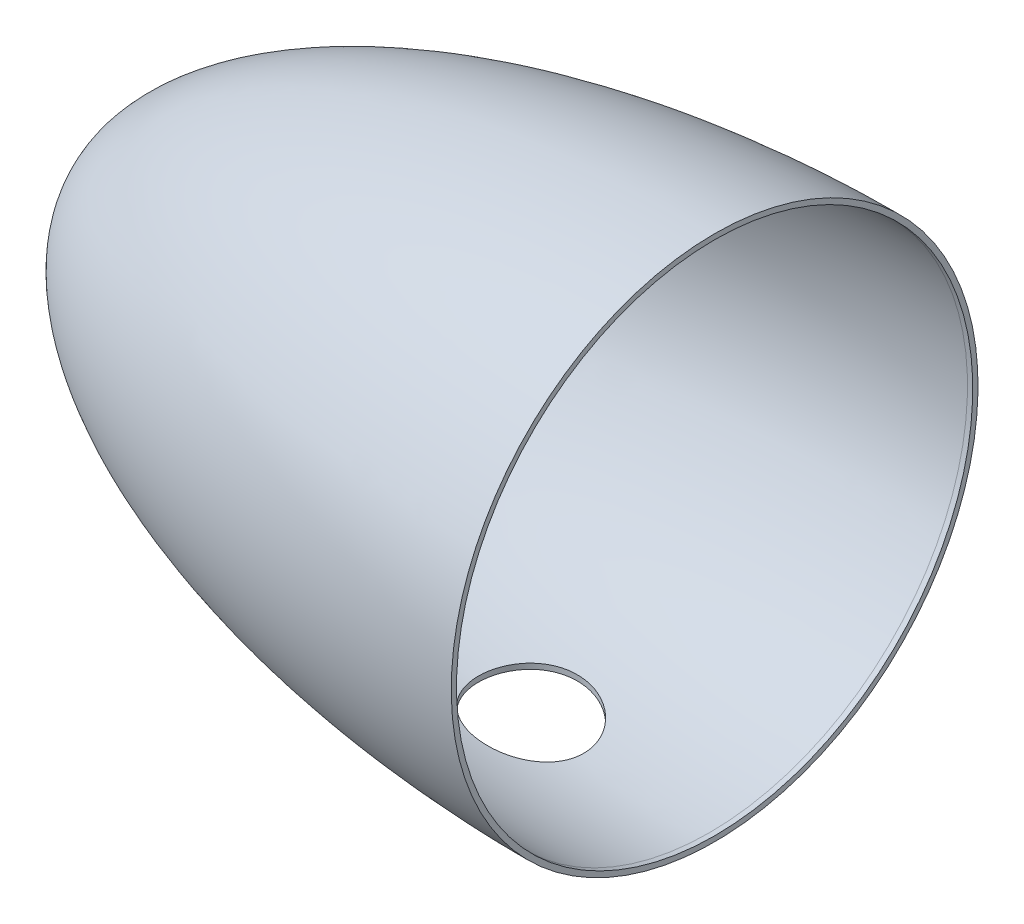
ISO-10303-21;
HEADER;
FILE_DESCRIPTION(('STEP AP214'),'2;1');
FILE_NAME('part.step','',(''),(''),'','','');
FILE_SCHEMA(('AUTOMOTIVE_DESIGN { 1 0 10303 214 1 1 1 1 }'));
ENDSEC;
DATA;
#1=APPLICATION_CONTEXT('core data for automotive mechanical design processes');
#2=APPLICATION_PROTOCOL_DEFINITION('international standard','automotive_design',2000,#1);
#3=PRODUCT_CONTEXT('',#1,'mechanical');
#4=PRODUCT('Part','Part','',(#3));
#5=PRODUCT_RELATED_PRODUCT_CATEGORY('part','',(#4));
#6=PRODUCT_DEFINITION_FORMATION('','',#4);
#7=PRODUCT_DEFINITION_CONTEXT('part definition',#1,'design');
#8=PRODUCT_DEFINITION('design','',#6,#7);
#9=PRODUCT_DEFINITION_SHAPE('','',#8);
#10=(LENGTH_UNIT() NAMED_UNIT(*) SI_UNIT(.MILLI.,.METRE.));
#11=(NAMED_UNIT(*) PLANE_ANGLE_UNIT() SI_UNIT($,.RADIAN.));
#12=(NAMED_UNIT(*) SI_UNIT($,.STERADIAN.) SOLID_ANGLE_UNIT());
#13=UNCERTAINTY_MEASURE_WITH_UNIT(LENGTH_MEASURE(1.E-05),#10,'distance_accuracy_value','');
#14=(GEOMETRIC_REPRESENTATION_CONTEXT(3) GLOBAL_UNCERTAINTY_ASSIGNED_CONTEXT((#13)) GLOBAL_UNIT_ASSIGNED_CONTEXT((#10,
#11,#12)) REPRESENTATION_CONTEXT('',''));
#15=CARTESIAN_POINT('',(0.,0.,0.));
#16=DIRECTION('',(0.,0.,1.));
#17=DIRECTION('',(1.,0.,0.));
#18=AXIS2_PLACEMENT_3D('',#15,#16,#17);
#19=CARTESIAN_POINT('',(0.,0.,0.));
#20=DIRECTION('',(0.,0.,1.));
#21=DIRECTION('',(-1.,0.,0.));
#22=AXIS2_PLACEMENT_3D('',#19,#20,#21);
#23=ELLIPSE('',#22,350.,150.);
#24=TRIMMED_CURVE('',#23,(PARAMETER_VALUE(3.14159265358979)),
(PARAMETER_VALUE(6.28318530717959)),.T.,.PARAMETER.);
#25=CARTESIAN_POINT('',(0.,0.,0.));
#26=DIRECTION('',(1.,0.,0.));
#27=AXIS1_PLACEMENT('',#25,#26);
#28=SURFACE_OF_REVOLUTION('',#24,#27);
#29=CARTESIAN_POINT('',(-104.509187939606,-139.978166426188,30.));
#30=CARTESIAN_POINT('',(-105.338743549904,-139.864409123884,29.9999958957549));
#31=CARTESIAN_POINT('',(-106.169189887263,-139.756422569953,29.9655657445175));
#32=CARTESIAN_POINT('',(-107.825939393802,-139.552798123035,29.827677399063));
#33=CARTESIAN_POINT('',(-108.652241938031,-139.457162041878,29.7242090905519));
#34=CARTESIAN_POINT('',(-110.295245014499,-139.278641355977,29.4485274819358));
#35=CARTESIAN_POINT('',(-111.111939323847,-139.195764635774,29.2762719096667));
#36=CARTESIAN_POINT('',(-112.729229614361,-139.042945984927,28.8639448591948));
#37=CARTESIAN_POINT('',(-113.52982619598,-138.973003571026,28.6238759155053));
#38=CARTESIAN_POINT('',(-115.109115356028,-138.845813944566,28.077388644288));
#39=CARTESIAN_POINT('',(-115.887807215015,-138.788567148559,27.7709681403711));
#40=CARTESIAN_POINT('',(-117.417538320646,-138.686216760411,27.0938029327586));
#41=CARTESIAN_POINT('',(-118.16857728161,-138.64111329369,26.7230575647552));
#42=CARTESIAN_POINT('',(-119.637393720246,-138.562209912002,25.9198371795799));
#43=CARTESIAN_POINT('',(-120.355174992817,-138.528408704631,25.4873692284101));
#44=CARTESIAN_POINT('',(-121.752323971302,-138.471010869237,24.5637040215406));
#45=CARTESIAN_POINT('',(-122.431691809935,-138.447414205956,24.0725069687713));
#46=CARTESIAN_POINT('',(-123.744708351226,-138.409206739241,23.0367409620322));
#47=CARTESIAN_POINT('',(-124.378513848343,-138.394563674321,22.4923719217593));
#48=CARTESIAN_POINT('',(-125.598588740537,-138.372717961579,21.352613040295));
#49=CARTESIAN_POINT('',(-126.184858251184,-138.365515295668,20.7572233231539));
#50=CARTESIAN_POINT('',(-127.305744914369,-138.357059915779,19.5195814184548));
#51=CARTESIAN_POINT('',(-127.840359928597,-138.355807448014,18.8773272928096));
#52=CARTESIAN_POINT('',(-128.854164618362,-138.357741929516,17.5504759378412));
#53=CARTESIAN_POINT('',(-129.333353978537,-138.360928904041,16.8658784676257));
#54=CARTESIAN_POINT('',(-130.235833477877,-138.370296144782,15.4546332414256));
#55=CARTESIAN_POINT('',(-130.65874773306,-138.376495366183,14.7277452094531));
#56=CARTESIAN_POINT('',(-131.442076692454,-138.390480639504,13.2410526969513));
#57=CARTESIAN_POINT('',(-131.802491167351,-138.398266697247,12.4812480956623));
#58=CARTESIAN_POINT('',(-132.458287511159,-138.414150372468,10.934065973558));
#59=CARTESIAN_POINT('',(-132.75366862663,-138.422247993555,10.1466881334166));
#60=CARTESIAN_POINT('',(-133.277311854264,-138.437661837431,8.549913604128));
#61=CARTESIAN_POINT('',(-133.505573885517,-138.444978059278,7.74051688843902));
#62=CARTESIAN_POINT('',(-133.894097239862,-138.457979560752,6.10232874860911));
#63=CARTESIAN_POINT('',(-134.054099391578,-138.463658598275,5.27347579336066));
#64=CARTESIAN_POINT('',(-134.30371284332,-138.472716182388,3.60522304090774));
#65=CARTESIAN_POINT('',(-134.393323944158,-138.47609472247,2.76582321386531));
#66=CARTESIAN_POINT('',(-134.501514446623,-138.480191534421,1.08245394620632));
#67=CARTESIAN_POINT('',(-134.520094061573,-138.48090981428,0.238484519320945));
#68=CARTESIAN_POINT('',(-134.486089184339,-138.479611021506,-1.44801638568287));
#69=CARTESIAN_POINT('',(-134.433504772559,-138.477593951964,-2.29054786542489));
#70=CARTESIAN_POINT('',(-134.257600640502,-138.471038531807,-3.96767474423882));
#71=CARTESIAN_POINT('',(-134.134323168818,-138.466501687148,-4.8022745809506));
#72=CARTESIAN_POINT('',(-133.817943947503,-138.455399047064,-6.45811900243092));
#73=CARTESIAN_POINT('',(-133.624842196804,-138.448833251608,-7.27936358699515));
#74=CARTESIAN_POINT('',(-133.170184671108,-138.434427027663,-8.90268203555648));
#75=CARTESIAN_POINT('',(-132.908627829112,-138.426586579307,-9.70475560052498));
#76=CARTESIAN_POINT('',(-132.318917753827,-138.410623699659,-11.2840328642185));
#77=CARTESIAN_POINT('',(-131.990764469945,-138.402501268153,-12.0612365440498));
#78=CARTESIAN_POINT('',(-131.27000036921,-138.387167957517,-13.5856587866955));
#79=CARTESIAN_POINT('',(-130.87735639443,-138.379957550698,-14.3328616773549));
#80=CARTESIAN_POINT('',(-130.030513918767,-138.367817208568,-15.7915531283387));
#81=CARTESIAN_POINT('',(-129.576315376028,-138.362887274808,-16.5030416643779));
#82=CARTESIAN_POINT('',(-128.609589685911,-138.3567895005,-17.8852423007414));
#83=CARTESIAN_POINT('',(-128.097062549759,-138.355621659228,-18.5559544089134));
#84=CARTESIAN_POINT('',(-127.017335408431,-138.358594540853,-19.8518149677959));
#85=CARTESIAN_POINT('',(-126.450135499982,-138.362735254358,-20.4769634991141));
#86=CARTESIAN_POINT('',(-125.265817936962,-138.377870558376,-21.6765283094474));
#87=CARTESIAN_POINT('',(-124.648758592391,-138.388857240758,-22.25100225244));
#88=CARTESIAN_POINT('',(-123.368611930407,-138.419173669656,-23.3459101078248));
#89=CARTESIAN_POINT('',(-122.705524643754,-138.438503410597,-23.8663440563304));
#90=CARTESIAN_POINT('',(-121.338194767985,-138.486887224056,-24.8494163342362));
#91=CARTESIAN_POINT('',(-120.633954481623,-138.515940752899,-25.3120578929253));
#92=CARTESIAN_POINT('',(-119.189466483789,-138.584981337508,-26.1762825079596));
#93=CARTESIAN_POINT('',(-118.449218984413,-138.624968328878,-26.5778659239039));
#94=CARTESIAN_POINT('',(-116.943210573622,-138.716550328558,-27.3147061387559));
#95=CARTESIAN_POINT('',(-116.177651358367,-138.768066616895,-27.6503850363899));
#96=CARTESIAN_POINT('',(-114.622025568928,-138.883543405941,-28.2564564470359));
#97=CARTESIAN_POINT('',(-113.831959125499,-138.947503840266,-28.5268493083052));
#98=CARTESIAN_POINT('',(-112.233129602056,-139.088248942741,-29.0006187488452));
#99=CARTESIAN_POINT('',(-111.424367128959,-139.165033195101,-29.2039975002931));
#100=CARTESIAN_POINT('',(-109.794003274363,-139.331478592643,-29.5425780051082));
#101=CARTESIAN_POINT('',(-108.972401873518,-139.421139757229,-29.6777796557416));
#102=CARTESIAN_POINT('',(-107.323418828471,-139.61291421105,-29.8792417452727));
#103=CARTESIAN_POINT('',(-106.496046851021,-139.715009948075,-29.9455981319098));
#104=CARTESIAN_POINT('',(-104.840216613033,-139.931126184732,-30.0096134609459));
#105=CARTESIAN_POINT('',(-104.011758355517,-140.045146651244,-30.0072725941372));
#106=CARTESIAN_POINT('',(-102.359401722701,-140.284174203556,-29.9343010297472));
#107=CARTESIAN_POINT('',(-101.535503656114,-140.40918202373,-29.8636657643253));
#108=CARTESIAN_POINT('',(-99.8978494635359,-140.668936764034,-29.6549651821095));
#109=CARTESIAN_POINT('',(-99.0840934828063,-140.803683823467,-29.5168989006651));
#110=CARTESIAN_POINT('',(-97.458761089981,-141.083702975206,-29.1717844412841));
#111=CARTESIAN_POINT('',(-96.6474417045982,-141.229111944834,-28.9636367190021));
#112=CARTESIAN_POINT('',(-95.0461509779131,-141.526618658008,-28.480700575356));
#113=CARTESIAN_POINT('',(-94.2561798420563,-141.678716465887,-28.2059115129204));
#114=CARTESIAN_POINT('',(-92.7026015679328,-141.987600374554,-27.5917075390245));
#115=CARTESIAN_POINT('',(-91.9389979605136,-142.144387098023,-27.2522840117733));
#116=CARTESIAN_POINT('',(-90.4431515397807,-142.46044825905,-26.5111928502364));
#117=CARTESIAN_POINT('',(-89.710909173832,-142.619722732049,-26.109524328409));
#118=CARTESIAN_POINT('',(-88.2658826431785,-142.942156650841,-25.236560553599));
#119=CARTESIAN_POINT('',(-87.5539443714365,-143.105320477764,-24.7638658295831));
#120=CARTESIAN_POINT('',(-86.172611449079,-143.429282974956,-23.7591950481605));
#121=CARTESIAN_POINT('',(-85.5032175431278,-143.59008160379,-23.2272179535686));
#122=CARTESIAN_POINT('',(-84.2115597987651,-143.906712316464,-22.1073951143535));
#123=CARTESIAN_POINT('',(-83.5892989299539,-144.062544087013,-21.5195458547771));
#124=CARTESIAN_POINT('',(-82.3963979874525,-144.366610983604,-20.2917987943763));
#125=CARTESIAN_POINT('',(-81.8257575767861,-144.514846159233,-19.6519013333723));
#126=CARTESIAN_POINT('',(-80.7397986666113,-144.801283368693,-18.3235584870131));
#127=CARTESIAN_POINT('',(-80.2245357363267,-144.939475280295,-17.6350654643411));
#128=CARTESIAN_POINT('',(-79.2540161677028,-145.203165120506,-16.2146884565905));
#129=CARTESIAN_POINT('',(-78.7987598775563,-145.328662975456,-15.4828042197669));
#130=CARTESIAN_POINT('',(-77.9520837400245,-145.564592175889,-13.9808186277803));
#131=CARTESIAN_POINT('',(-77.5606538522039,-145.675025890641,-13.2107233084528));
#132=CARTESIAN_POINT('',(-76.8449601385876,-145.878703942698,-11.6377422160594));
#133=CARTESIAN_POINT('',(-76.5206941924154,-145.971948822647,-10.834857479119));
#134=CARTESIAN_POINT('',(-75.9512239930217,-146.136795838866,-9.2275161616858));
#135=CARTESIAN_POINT('',(-75.7038867387012,-146.208977599074,-8.42387441286576));
#136=CARTESIAN_POINT('',(-75.2772816156569,-146.334050341257,-6.79724718572349));
#137=CARTESIAN_POINT('',(-75.0980124500897,-146.386941690754,-5.97426207625113));
#138=CARTESIAN_POINT('',(-74.8092333401842,-146.472379494725,-4.31526170442513));
#139=CARTESIAN_POINT('',(-74.6997097382396,-146.504929932342,-3.47924902600423));
#140=CARTESIAN_POINT('',(-74.5514089760834,-146.549047769089,-1.80042624696612));
#141=CARTESIAN_POINT('',(-74.5126302485059,-146.56061563309,-0.957616297359253));
#142=CARTESIAN_POINT('',(-74.5062934090335,-146.562504784111,0.699646848759912));
#143=CARTESIAN_POINT('',(-74.5363617974382,-146.553534135716,1.51409122430884));
#144=CARTESIAN_POINT('',(-74.6625864626391,-146.515967151646,3.13736868851193));
#145=CARTESIAN_POINT('',(-74.7587410155191,-146.487371327911,3.94620192298176));
#146=CARTESIAN_POINT('',(-75.0162775558513,-146.411092244035,5.55246192487814));
#147=CARTESIAN_POINT('',(-75.1776571645565,-146.363409679985,6.34988910718355));
#148=CARTESIAN_POINT('',(-75.5642409556115,-146.249839510907,7.92779067630414));
#149=CARTESIAN_POINT('',(-75.7894456786084,-146.183951751667,8.70826491945479));
#150=CARTESIAN_POINT('',(-76.3012075259254,-146.035333175598,10.2452148204748));
#151=CARTESIAN_POINT('',(-76.5876266808621,-145.952640255676,11.0017401250269));
#152=CARTESIAN_POINT('',(-77.2197987273033,-145.771778434569,12.4876393491821));
#153=CARTESIAN_POINT('',(-77.5655512684532,-145.673609624767,13.2170134290781));
#154=CARTESIAN_POINT('',(-78.3137543156959,-145.463466499498,14.6440563311143));
#155=CARTESIAN_POINT('',(-78.7162093072636,-145.351491091941,15.3417226392156));
#156=CARTESIAN_POINT('',(-79.5748438307175,-145.115595273529,16.7010414036838));
#157=CARTESIAN_POINT('',(-80.0310246153793,-144.991674584146,17.3626930197355));
#158=CARTESIAN_POINT('',(-81.0087598076109,-144.729901799592,18.6658424908613));
#159=CARTESIAN_POINT('',(-81.5318948460109,-144.591738194436,19.3060921458477));
#160=CARTESIAN_POINT('',(-82.6281644947341,-144.307101307976,20.540255708584));
#161=CARTESIAN_POINT('',(-83.2013001176967,-144.160627858397,21.1341686774362));
#162=CARTESIAN_POINT('',(-84.3938955092799,-143.861649017912,22.2722840441067));
#163=CARTESIAN_POINT('',(-85.0133711982901,-143.709141562545,22.8164692136923));
#164=CARTESIAN_POINT('',(-86.2944257895102,-143.400488657051,23.8516380939217));
#165=CARTESIAN_POINT('',(-86.9560050040686,-143.244343179939,24.3426214098102));
#166=CARTESIAN_POINT('',(-88.3404865186817,-142.925342072711,25.2843401527412));
#167=CARTESIAN_POINT('',(-89.0647151163842,-142.762440305564,25.7331115868763));
#168=CARTESIAN_POINT('',(-90.5489414719971,-142.437727411106,26.5675813667553));
#169=CARTESIAN_POINT('',(-91.3089417290532,-142.275916360904,26.9532752972141));
#170=CARTESIAN_POINT('',(-92.8590175856059,-141.955919230222,27.6585988411366));
#171=CARTESIAN_POINT('',(-93.6490702549936,-141.797730527876,27.9782776728083));
#172=CARTESIAN_POINT('',(-95.2544284975173,-141.487119958405,28.5495183064));
#173=CARTESIAN_POINT('',(-96.0697292857015,-141.334697010588,28.8010929282581));
#174=CARTESIAN_POINT('',(-97.513670434811,-141.074806943935,29.1799975840899));
#175=CARTESIAN_POINT('',(-98.1380263588133,-140.965626346661,29.3226653980987));
#176=CARTESIAN_POINT('',(-99.3955817954601,-140.752403092488,29.5679120340228));
#177=CARTESIAN_POINT('',(-100.028782843639,-140.648361342289,29.6704838032897));
#178=CARTESIAN_POINT('',(-101.301365982725,-140.446142102891,29.8349038921474));
#179=CARTESIAN_POINT('',(-101.940747921423,-140.347964469707,29.8967532119862));
#180=CARTESIAN_POINT('',(-103.222971083327,-140.158090477504,29.9792989321614));
#181=CARTESIAN_POINT('',(-103.865811623145,-140.066392885292,30.0000031831189));
#182=CARTESIAN_POINT('',(-104.509187939606,-139.978166426188,30.));
#183=B_SPLINE_CURVE_WITH_KNOTS('',3,(#29,#30,#31,#32,#33,#34,#35,#36,#37,#38,#39,#40,#41,#42,
#43,#44,#45,#46,#47,#48,#49,#50,#51,#52,#53,#54,#55,#56,#57,#58,#59,#60,#61,#62,#63,#64,#65,#66,
#67,#68,#69,#70,#71,#72,#73,#74,#75,#76,#77,#78,#79,#80,#81,#82,#83,#84,#85,#86,#87,#88,#89,#90,
#91,#92,#93,#94,#95,#96,#97,#98,#99,#100,#101,#102,#103,#104,#105,#106,#107,#108,#109,#110,#111,
#112,#113,#114,#115,#116,#117,#118,#119,#120,#121,#122,#123,#124,#125,#126,#127,#128,#129,#130,
#131,#132,#133,#134,#135,#136,#137,#138,#139,#140,#141,#142,#143,#144,#145,#146,#147,#148,#149,
#150,#151,#152,#153,#154,#155,#156,#157,#158,#159,#160,#161,#162,#163,#164,#165,#166,#167,#168,
#169,#170,#171,#172,#173,#174,#175,#176,#177,#178,#179,#180,#181,#182),.UNSPECIFIED.,.T.,.F.,(4,
2,2,2,2,2,2,2,2,2,2,2,2,2,2,2,2,2,2,2,2,2,2,2,2,2,2,2,2,2,2,2,2,2,2,2,2,2,2,2,2,2,2,2,2,2,2,2,2,
2,2,2,2,2,2,2,2,2,2,2,2,2,2,2,2,2,2,2,2,2,2,2,2,2,2,2,4),(0.,2.51139131608301,5.02315063922567,
7.53645590703146,10.0496672529024,12.56296104679,15.076280797978,17.589313054734,
20.1023366282996,22.6062511129578,25.1101595098477,27.6141715151347,30.118197767114,
32.6381892819802,35.158190042635,37.6782199971255,40.19825298943,42.7277707629111,
45.2572956942169,47.7868130287747,50.3163275053767,52.8443318306275,55.3723361945535,
57.900379964468,60.4284256549072,62.957775233867,65.4871265327189,68.0164773447767,
70.5458236819862,73.0722536434333,75.5986819165314,78.1249689561615,80.6512411167611,
83.1607638602974,85.6702732169196,88.1797012229817,90.6891330104022,93.1950627549921,
95.7009855398826,98.2070759439026,100.713202200449,103.260637981444,105.808098269044,
108.355898371775,110.903734806534,113.510697283792,116.117705378782,118.724877590996,
121.332032782463,123.94178019879,126.551542757699,129.160894381902,131.770163615893,
134.298823796969,136.827435799212,139.355552495173,141.883613179562,144.325836758378,
146.767996632047,149.210067448581,151.652158951924,154.088803275024,156.525433210612,
158.96225600534,161.399135633047,163.911062953998,166.423041159699,168.935886368521,
171.448750221271,174.048004155758,176.647439954445,179.244930664787,181.841932082882,
183.789762544102,185.737935462762,187.686060527508,189.633813847573),.UNSPECIFIED.);
#184=CARTESIAN_POINT('',(-104.509187939606,-139.978166426188,30.));
#185=VERTEX_POINT('',#184);
#186=EDGE_CURVE('E69',#185,#185,#183,.T.);
#187=ORIENTED_EDGE('',*,*,#186,.F.);
#188=EDGE_LOOP('',(#187));
#189=FACE_BOUND('',#188,.T.);
#190=CARTESIAN_POINT('',(-350.,0.,0.));
#191=VERTEX_POINT('',#190);
#192=VERTEX_LOOP('',#191);
#193=FACE_BOUND('',#192,.T.);
#194=CARTESIAN_POINT('',(0.,0.,0.));
#195=DIRECTION('',(1.,0.,0.));
#196=DIRECTION('',(0.,1.,0.));
#197=AXIS2_PLACEMENT_3D('',#194,#195,#196);
#198=CIRCLE('',#197,150.);
#199=CARTESIAN_POINT('',(0.,150.,0.));
#200=VERTEX_POINT('',#199);
#201=EDGE_CURVE('E11',#200,#200,#198,.T.);
#202=ORIENTED_EDGE('',*,*,#201,.F.);
#203=EDGE_LOOP('',(#202));
#204=FACE_BOUND('',#203,.T.);
#205=ADVANCED_FACE('F33',(#189,#193,#204),#28,.F.);
#206=CARTESIAN_POINT('',(0.,150.,0.));
#207=DIRECTION('',(1.,0.,0.));
#208=DIRECTION('',(0.,1.,0.));
#209=AXIS2_PLACEMENT_3D('',#206,#207,#208);
#210=PLANE('',#209);
#211=ORIENTED_EDGE('',*,*,#201,.T.);
#212=EDGE_LOOP('',(#211));
#213=FACE_BOUND('',#212,.T.);
#214=CARTESIAN_POINT('',(0.,0.,0.));
#215=DIRECTION('',(1.,0.,0.));
#216=DIRECTION('',(0.,1.,0.));
#217=AXIS2_PLACEMENT_3D('',#214,#215,#216);
#218=CIRCLE('',#217,146.994469377078);
#219=CARTESIAN_POINT('',(0.,146.994469377078,0.));
#220=VERTEX_POINT('',#219);
#221=EDGE_CURVE('E46',#220,#220,#218,.T.);
#222=ORIENTED_EDGE('',*,*,#221,.F.);
#223=EDGE_LOOP('',(#222));
#224=FACE_BOUND('',#223,.T.);
#225=ADVANCED_FACE('F51',(#213,#224),#210,.T.);
#226=CARTESIAN_POINT('',(0.,0.,0.));
#227=DIRECTION('',(1.,0.,0.));
#228=DIRECTION('',(0.,1.,0.));
#229=AXIS2_PLACEMENT_3D('',#226,#227,#228);
#230=CYLINDRICAL_SURFACE('',#229,146.994469377078);
#231=ORIENTED_EDGE('',*,*,#221,.T.);
#232=EDGE_LOOP('',(#231));
#233=FACE_BOUND('',#232,.T.);
#234=CARTESIAN_POINT('',(-3.00000000000007,0.,0.));
#235=DIRECTION('',(1.,0.,0.));
#236=DIRECTION('',(0.,1.,0.));
#237=AXIS2_PLACEMENT_3D('',#234,#235,#236);
#238=CIRCLE('',#237,146.994469377078);
#239=CARTESIAN_POINT('',(-3.00000000000008,146.994469377078,0.));
#240=VERTEX_POINT('',#239);
#241=EDGE_CURVE('E61',#240,#240,#238,.T.);
#242=ORIENTED_EDGE('',*,*,#241,.F.);
#243=EDGE_LOOP('',(#242));
#244=FACE_BOUND('',#243,.T.);
#245=ADVANCED_FACE('F57',(#233,#244),#230,.F.);
#246=CARTESIAN_POINT('',(-346.926567102263,3.00000000000001,0.));
#247=CARTESIAN_POINT('',(-346.813727301466,5.3047588171815,0.));
#248=CARTESIAN_POINT('',(-346.331578228713,9.88186879817648,0.));
#249=CARTESIAN_POINT('',(-344.331694511466,19.0575246996472,0.));
#250=CARTESIAN_POINT('',(-339.887273398816,30.4741647483363,0.));
#251=CARTESIAN_POINT('',(-331.43238610795,44.008781696331,0.));
#252=CARTESIAN_POINT('',(-316.046042327794,61.6390253153621,0.));
#253=CARTESIAN_POINT('',(-289.294666984066,82.5186941538434,0.));
#254=CARTESIAN_POINT('',(-246.320556553486,104.604502967275,0.));
#255=CARTESIAN_POINT('',(-194.113298986661,122.809254684914,0.));
#256=CARTESIAN_POINT('',(-144.553080527012,134.145306343508,0.));
#257=CARTESIAN_POINT('',(-102.392138924449,140.653620405848,0.));
#258=CARTESIAN_POINT('',(-69.8098956548104,144.210411461595,0.));
#259=CARTESIAN_POINT('',(-36.5883233560263,146.408003651111,0.));
#260=CARTESIAN_POINT('',(-14.1774121707521,146.953256577554,0.));
#261=CARTESIAN_POINT('',(-3.00000000000017,146.994469377078,0.));
#262=B_SPLINE_CURVE_WITH_KNOTS('',3,(#246,#247,#248,#249,#250,#251,#252,#253,#254,#255,#256,
#257,#258,#259,#260,#261),.UNSPECIFIED.,.F.,.F.,(4,1,1,1,1,1,1,1,1,1,1,1,1,4),
(-1.56219318816714,-1.51403026219817,-1.46586733622921,-1.36954148429128,-1.27321563235336,
-1.17688978041543,-0.984238076539572,-0.791586372663717,-0.598934668787862,-0.406282964912006,
-0.309957112974078,-0.213631261036151,-0.117305409098223,-0.0209795571602953),.UNSPECIFIED.);
#263=CARTESIAN_POINT('',(0.,0.,0.));
#264=DIRECTION('',(1.,0.,0.));
#265=AXIS1_PLACEMENT('',#263,#264);
#266=SURFACE_OF_REVOLUTION('',#262,#265);
#267=CARTESIAN_POINT('',(-104.509187939606,-136.880951210008,30.));
#268=CARTESIAN_POINT('',(-103.654911344241,-136.998706609246,29.9999944223758));
#269=CARTESIAN_POINT('',(-102.801355414403,-137.122778307448,29.9634791165229));
#270=CARTESIAN_POINT('',(-101.102052795768,-137.382322629866,29.8180991991232));
#271=CARTESIAN_POINT('',(-100.256308127927,-137.517798117616,29.7092163682139));
#272=CARTESIAN_POINT('',(-98.5778015946764,-137.798740369295,29.4201394844112));
#273=CARTESIAN_POINT('',(-97.7450548075014,-137.944217811827,29.2398682049538));
#274=CARTESIAN_POINT('',(-96.0992986925087,-138.243184591943,28.8096713697247));
#275=CARTESIAN_POINT('',(-95.2862881725077,-138.396673443818,28.5597500326534));
#276=CARTESIAN_POINT('',(-93.6864521448917,-138.709394574895,27.9926371505616));
#277=CARTESIAN_POINT('',(-92.8995941128163,-138.868619164486,27.6755330784036));
#278=CARTESIAN_POINT('',(-91.3561477748239,-139.190742162197,26.9762002683071));
#279=CARTESIAN_POINT('',(-90.599559869219,-139.353640618858,26.5939706694566));
#280=CARTESIAN_POINT('',(-89.1217485958423,-139.680674949693,25.7671011391922));
#281=CARTESIAN_POINT('',(-88.4005193230799,-139.844810611931,25.3224716769664));
#282=CARTESIAN_POINT('',(-86.9980371045119,-140.171834231004,24.3736825006009));
#283=CARTESIAN_POINT('',(-86.3167843919418,-140.334722180554,23.8695224391935));
#284=CARTESIAN_POINT('',(-84.9899578895456,-140.658836378216,22.7977339653193));
#285=CARTESIAN_POINT('',(-84.3449864131303,-140.820010900054,22.229343854672));
#286=CARTESIAN_POINT('',(-83.1053521067862,-141.135720942753,21.0384070701929));
#287=CARTESIAN_POINT('',(-82.5106899029776,-141.290256380977,20.4158597225465));
#288=CARTESIAN_POINT('',(-81.3760563014676,-141.589997465041,19.1206550821162));
#289=CARTESIAN_POINT('',(-80.8360856642844,-141.735202981132,18.4479970927401));
#290=CARTESIAN_POINT('',(-79.8150315072965,-142.013657721031,17.0570488178125));
#291=CARTESIAN_POINT('',(-79.3339469392038,-142.14690715767,16.3387593449372));
#292=CARTESIAN_POINT('',(-78.4404518435345,-142.397311861864,14.8710938839514));
#293=CARTESIAN_POINT('',(-78.0272277197938,-142.514654314945,14.122245306403));
#294=CARTESIAN_POINT('',(-77.2654283846974,-142.733045341426,12.5900558802884));
#295=CARTESIAN_POINT('',(-76.9168528957725,-142.834093984783,11.8067151798323));
#296=CARTESIAN_POINT('',(-76.2875072534458,-143.017900637724,10.2113603066928));
#297=CARTESIAN_POINT('',(-76.0067223982133,-143.100662612827,9.3993523949639));
#298=CARTESIAN_POINT('',(-75.5154738427668,-143.246253747293,7.75259580379924));
#299=CARTESIAN_POINT('',(-75.3050077469176,-143.309083585706,6.91784790012267));
#300=CARTESIAN_POINT('',(-74.9630776741545,-143.411521232334,5.26428850290065));
#301=CARTESIAN_POINT('',(-74.8289037014481,-143.451924214437,4.4460857548569));
#302=CARTESIAN_POINT('',(-74.6287055758205,-143.512309666485,2.80064328599088));
#303=CARTESIAN_POINT('',(-74.5626796296114,-143.532292673773,1.97340380354555));
#304=CARTESIAN_POINT('',(-74.4993972123652,-143.551444036322,0.316182571293901));
#305=CARTESIAN_POINT('',(-74.5021305603613,-143.550615473085,-0.513798754340145));
#306=CARTESIAN_POINT('',(-74.5763162917766,-143.52816746718,-2.17039725744552));
#307=CARTESIAN_POINT('',(-74.6477679812083,-143.506548234477,-2.99701446880643));
#308=CARTESIAN_POINT('',(-74.8560987601611,-143.443735727711,-4.62030934592685));
#309=CARTESIAN_POINT('',(-74.9913107663488,-143.403041347664,-5.41722102341478));
#310=CARTESIAN_POINT('',(-75.3252609231974,-143.303041530213,-6.99640797372076));
#311=CARTESIAN_POINT('',(-75.5239977400218,-143.243736483579,-7.77868355348931));
#312=CARTESIAN_POINT('',(-75.9833185459128,-143.107590139199,-9.32330535014794));
#313=CARTESIAN_POINT('',(-76.2439043123285,-143.030748337502,-10.0856509936137));
#314=CARTESIAN_POINT('',(-76.8247921525943,-142.860891907087,-11.5853751343599));
#315=CARTESIAN_POINT('',(-77.1450952953459,-142.767876988882,-12.3227531844577));
#316=CARTESIAN_POINT('',(-77.8476342320224,-142.565921384058,-13.7776233283165));
#317=CARTESIAN_POINT('',(-78.2306490978547,-142.456782310077,-14.4947115608924));
#318=CARTESIAN_POINT('',(-79.0525158900199,-142.225413354051,-15.8939039723811));
#319=CARTESIAN_POINT('',(-79.4913680784571,-142.103183410558,-16.5760079870545));
#320=CARTESIAN_POINT('',(-80.421791168306,-141.847643084427,-17.9011975188458));
#321=CARTESIAN_POINT('',(-80.913369859053,-141.714331065281,-18.5442772488371));
#322=CARTESIAN_POINT('',(-81.9458023751351,-141.438780217973,-19.7875361554275));
#323=CARTESIAN_POINT('',(-82.4866574186833,-141.296541169144,-20.3877142707554));
#324=CARTESIAN_POINT('',(-83.6353639453503,-140.999845599784,-21.5634918290994));
#325=CARTESIAN_POINT('',(-84.2449732323997,-140.845130600894,-22.1373096294879));
#326=CARTESIAN_POINT('',(-85.5092760555797,-140.530960630364,-23.2314942232651));
#327=CARTESIAN_POINT('',(-86.1639706513181,-140.371505547372,-23.7518597596869));
#328=CARTESIAN_POINT('',(-87.5142301214935,-140.050322793373,-24.7359946314957));
#329=CARTESIAN_POINT('',(-88.2098011314418,-139.888594783989,-25.1997554382565));
#330=CARTESIAN_POINT('',(-89.6372394947742,-139.565334224118,-26.0676597349874));
#331=CARTESIAN_POINT('',(-90.3691072418763,-139.403801675772,-26.4718025780807));
#332=CARTESIAN_POINT('',(-91.8840155296579,-139.079103130853,-27.2275614809589));
#333=CARTESIAN_POINT('',(-92.6678933918714,-138.916004679195,-27.5775297665124));
#334=CARTESIAN_POINT('',(-94.2636781009153,-138.594913492954,-28.2093241687678));
#335=CARTESIAN_POINT('',(-95.0755855167321,-138.436920862145,-28.4911489012573));
#336=CARTESIAN_POINT('',(-96.7218621841532,-138.128280628437,-28.9844079266515));
#337=CARTESIAN_POINT('',(-97.5562309466265,-137.977632865794,-29.1958437510467));
#338=CARTESIAN_POINT('',(-99.2416219941969,-137.685685426899,-29.54646484432));
#339=CARTESIAN_POINT('',(-100.09264403741,-137.544385615002,-29.6856511617931));
#340=CARTESIAN_POINT('',(-101.79891853317,-137.273863878644,-29.8895833988627));
#341=CARTESIAN_POINT('',(-102.654093012672,-137.1445602762,-29.9548728396263));
#342=CARTESIAN_POINT('',(-104.368668373519,-136.898233725163,-30.011930666943));
#343=CARTESIAN_POINT('',(-105.22806924873,-136.781210758749,-30.0036991601836));
#344=CARTESIAN_POINT('',(-106.944589438295,-136.560478973197,-29.9133309730121));
#345=CARTESIAN_POINT('',(-107.801709033616,-136.45676843238,-29.8312038604562));
#346=CARTESIAN_POINT('',(-109.50724567943,-136.263277660775,-29.5932549305325));
#347=CARTESIAN_POINT('',(-110.355662908455,-136.173497143672,-29.4374346281076));
#348=CARTESIAN_POINT('',(-112.016150628811,-136.010166714858,-29.0577460938794));
#349=CARTESIAN_POINT('',(-112.828599228977,-135.936266577299,-28.8356801542366));
#350=CARTESIAN_POINT('',(-114.432931027445,-135.80176550505,-28.3236350828303));
#351=CARTESIAN_POINT('',(-115.224814566276,-135.741164350023,-28.0336570763955));
#352=CARTESIAN_POINT('',(-116.782053365105,-135.632757832072,-27.3877217693918));
#353=CARTESIAN_POINT('',(-117.547410041385,-135.584951785092,-27.031767997761));
#354=CARTESIAN_POINT('',(-119.045917902015,-135.501305982416,-26.2563359153815));
#355=CARTESIAN_POINT('',(-119.779069191258,-135.465466187743,-25.8368578115517));
#356=CARTESIAN_POINT('',(-121.198806955786,-135.405030514084,-24.9429654699581));
#357=CARTESIAN_POINT('',(-121.88585959826,-135.380300175981,-24.4693003816911));
#358=CARTESIAN_POINT('',(-123.218288118196,-135.340161574021,-23.4662508398246));
#359=CARTESIAN_POINT('',(-123.863664417579,-135.324753215776,-22.9368669504529));
#360=CARTESIAN_POINT('',(-125.108156982522,-135.301829469421,-21.8260886156175));
#361=CARTESIAN_POINT('',(-125.707272290054,-135.294314244729,-21.2446930935729));
#362=CARTESIAN_POINT('',(-126.855001799986,-135.285652769489,-20.0339809234686));
#363=CARTESIAN_POINT('',(-127.40361564835,-135.284506563586,-19.4046639395153));
#364=CARTESIAN_POINT('',(-128.44899479031,-135.287029102556,-18.0993956961801));
#365=CARTESIAN_POINT('',(-128.945499237516,-135.290720929259,-17.423235565738));
#366=CARTESIAN_POINT('',(-129.880149029627,-135.301399869622,-16.0317433951673));
#367=CARTESIAN_POINT('',(-130.318294259587,-135.308386989772,-15.3164112778889));
#368=CARTESIAN_POINT('',(-131.133165326189,-135.324175792152,-13.8515803057061));
#369=CARTESIAN_POINT('',(-131.509889893556,-135.332977511872,-13.1020807451318));
#370=CARTESIAN_POINT('',(-132.199272923401,-135.351044717211,-11.5741795900613));
#371=CARTESIAN_POINT('',(-132.511931180152,-135.360310204318,-10.7957779027651));
#372=CARTESIAN_POINT('',(-133.072629156646,-135.378181998303,-9.21089098335414));
#373=CARTESIAN_POINT('',(-133.320279508005,-135.38678412458,-8.4042679207783));
#374=CARTESIAN_POINT('',(-133.746783442717,-135.402291714165,-6.7730154090538));
#375=CARTESIAN_POINT('',(-133.925636749914,-135.409197170662,-5.94838588764015));
#376=CARTESIAN_POINT('',(-134.213271145088,-135.420586761419,-4.28697898959071));
#377=CARTESIAN_POINT('',(-134.322052327508,-135.425070898943,-3.45020162932964));
#378=CARTESIAN_POINT('',(-134.468765404823,-135.431169173998,-1.77044918407866));
#379=CARTESIAN_POINT('',(-134.506697394903,-135.432783315386,-0.927474107416912));
#380=CARTESIAN_POINT('',(-134.511440948888,-135.432983741814,0.758642252030858));
#381=CARTESIAN_POINT('',(-134.478255401137,-135.431570149821,1.60178352667636));
#382=CARTESIAN_POINT('',(-134.341007134039,-135.425853502363,3.28226757467323));
#383=CARTESIAN_POINT('',(-134.236944383209,-135.421550445614,4.11961034544868));
#384=CARTESIAN_POINT('',(-133.958683716383,-135.410484362511,5.78255202676912));
#385=CARTESIAN_POINT('',(-133.784485070241,-135.403721310547,6.60815081496109));
#386=CARTESIAN_POINT('',(-133.367194088114,-135.388442030748,8.2417330180957));
#387=CARTESIAN_POINT('',(-133.124101730217,-135.379925802355,9.04971642743521));
#388=CARTESIAN_POINT('',(-132.570764698989,-135.362101349049,10.6422976630071));
#389=CARTESIAN_POINT('',(-132.260523367968,-135.35279316357,11.4268966509779));
#390=CARTESIAN_POINT('',(-131.575080110626,-135.334567060501,12.9671919427299));
#391=CARTESIAN_POINT('',(-131.199878154789,-135.325649143087,13.7228882333782));
#392=CARTESIAN_POINT('',(-130.387175554709,-135.309568806473,15.2000111920917));
#393=CARTESIAN_POINT('',(-129.949675795442,-135.302406362338,15.9214383467749));
#394=CARTESIAN_POINT('',(-129.015473416607,-135.29133787686,17.3249123347412));
#395=CARTESIAN_POINT('',(-128.518770851869,-135.2874318325,18.006959204495));
#396=CARTESIAN_POINT('',(-127.469559473202,-135.284460350255,19.326984859827));
#397=CARTESIAN_POINT('',(-126.917036497785,-135.28539614377,19.9649523931212));
#398=CARTESIAN_POINT('',(-125.760240213294,-135.293723087801,21.1920686136674));
#399=CARTESIAN_POINT('',(-125.155966714004,-135.301114262046,21.7812171214612));
#400=CARTESIAN_POINT('',(-123.899933245979,-135.323930434944,22.9065515126699));
#401=CARTESIAN_POINT('',(-123.248165938279,-135.339356677488,23.4427291804976));
#402=CARTESIAN_POINT('',(-121.901986794792,-135.37972241964,24.4581549593986));
#403=CARTESIAN_POINT('',(-121.207575747421,-135.40466174341,24.9374041225095));
#404=CARTESIAN_POINT('',(-119.784864707019,-135.465215012471,25.8332489461807));
#405=CARTESIAN_POINT('',(-119.056756396912,-135.500773658475,26.2501527843072));
#406=CARTESIAN_POINT('',(-117.568680246347,-135.583693384292,27.0213235981664));
#407=CARTESIAN_POINT('',(-116.808710812577,-135.631055054939,27.3755874367612));
#408=CARTESIAN_POINT('',(-115.263302978668,-135.738338412631,28.0187243603873));
#409=CARTESIAN_POINT('',(-114.477889006777,-135.798248337997,28.3076581566166));
#410=CARTESIAN_POINT('',(-112.886791193241,-135.931151960337,28.8186327949536));
#411=CARTESIAN_POINT('',(-112.081111814211,-136.004142798092,29.0406882269168));
#412=CARTESIAN_POINT('',(-110.713505545536,-136.138074893523,29.3569577482045));
#413=CARTESIAN_POINT('',(-110.1553672264,-136.195488766802,29.4693787293294));
#414=CARTESIAN_POINT('',(-109.034152767767,-136.316444779355,29.6622357199526));
#415=CARTESIAN_POINT('',(-108.471076072662,-136.379987616441,29.7426680820424));
#416=CARTESIAN_POINT('',(-107.341973154231,-136.513075118539,29.8713605865383));
#417=CARTESIAN_POINT('',(-106.775946973075,-136.582619697961,29.9196211876665));
#418=CARTESIAN_POINT('',(-105.642904056223,-136.72750048534,29.9839410498089));
#419=CARTESIAN_POINT('',(-105.075887431071,-136.802836082861,30.0000037000157));
#420=CARTESIAN_POINT('',(-104.509187939606,-136.880951210008,30.));
#421=B_SPLINE_CURVE_WITH_KNOTS('',3,(#267,#268,#269,#270,#271,#272,#273,#274,#275,#276,#277,
#278,#279,#280,#281,#282,#283,#284,#285,#286,#287,#288,#289,#290,#291,#292,#293,#294,#295,#296,
#297,#298,#299,#300,#301,#302,#303,#304,#305,#306,#307,#308,#309,#310,#311,#312,#313,#314,#315,
#316,#317,#318,#319,#320,#321,#322,#323,#324,#325,#326,#327,#328,#329,#330,#331,#332,#333,#334,
#335,#336,#337,#338,#339,#340,#341,#342,#343,#344,#345,#346,#347,#348,#349,#350,#351,#352,#353,
#354,#355,#356,#357,#358,#359,#360,#361,#362,#363,#364,#365,#366,#367,#368,#369,#370,#371,#372,
#373,#374,#375,#376,#377,#378,#379,#380,#381,#382,#383,#384,#385,#386,#387,#388,#389,#390,#391,
#392,#393,#394,#395,#396,#397,#398,#399,#400,#401,#402,#403,#404,#405,#406,#407,#408,#409,#410,
#411,#412,#413,#414,#415,#416,#417,#418,#419,#420),.UNSPECIFIED.,.T.,.F.,(4,2,2,2,2,2,2,2,2,2,2,
2,2,2,2,2,2,2,2,2,2,2,2,2,2,2,2,2,2,2,2,2,2,2,2,2,2,2,2,2,2,2,2,2,2,2,2,2,2,2,2,2,2,2,2,2,2,2,2,
2,2,2,2,2,2,2,2,2,2,2,2,2,2,2,2,2,4),(0.,2.58653730711411,5.17372605174739,7.76372124342111,
10.353559593302,12.9400464354933,15.5265674718074,18.1126550700754,20.6987577548615,
23.3196048009356,25.9404844597756,28.5614005584784,31.1822699929235,33.7689683765686,
36.3556556539534,38.941781448646,41.5278191296412,44.0151015942713,46.502318605397,
48.9891673444922,51.4759909691336,53.9011219640715,56.3262020416504,58.7513518170361,
61.1765450051651,63.6345400444437,66.0925466221466,68.5509168248951,71.009347820122,
73.5605320397069,76.1117762384292,78.6634043594654,81.2150601645626,83.8333668277193,
86.4517266725446,89.0700295445365,91.6882944146609,94.2871738489764,96.8860495120149,
99.4845887262108,102.083074523425,104.616471200876,107.149825901956,109.683045137032,
112.21625612079,114.71792186785,117.219562284615,119.721254494442,122.222964240871,
124.736652987154,127.250346684368,129.764092321152,132.277846029862,134.806329127691,
137.334822374901,139.863312214134,142.391798656336,144.9201824094,147.448567285595,
149.976978484145,152.505390486924,155.033676668067,157.561963998006,160.090215415787,
162.618464492069,165.147356596766,167.676257997228,170.205551007488,172.734797269186,
175.251095767014,177.767520250491,180.281596520865,182.79512393477,184.51095873242,
186.226989117057,187.9429950331,189.65882031094),.UNSPECIFIED.);
#422=CARTESIAN_POINT('',(-104.509187939606,-136.880951210008,30.));
#423=VERTEX_POINT('',#422);
#424=EDGE_CURVE('E38',#423,#423,#421,.T.);
#425=ORIENTED_EDGE('',*,*,#424,.F.);
#426=EDGE_LOOP('',(#425));
#427=FACE_BOUND('',#426,.T.);
#428=ORIENTED_EDGE('',*,*,#241,.T.);
#429=EDGE_LOOP('',(#428));
#430=FACE_BOUND('',#429,.T.);
#431=CARTESIAN_POINT('',(-346.926567102263,0.,0.));
#432=DIRECTION('',(1.,0.,0.));
#433=DIRECTION('',(0.,1.,0.));
#434=AXIS2_PLACEMENT_3D('',#431,#432,#433);
#435=CIRCLE('',#434,3.00000000000001);
#436=CARTESIAN_POINT('',(-346.926567102263,3.00000000000001,0.));
#437=VERTEX_POINT('',#436);
#438=EDGE_CURVE('E64',#437,#437,#435,.T.);
#439=ORIENTED_EDGE('',*,*,#438,.F.);
#440=EDGE_LOOP('',(#439));
#441=FACE_BOUND('',#440,.T.);
#442=ADVANCED_FACE('F78',(#427,#430,#441),#266,.F.);
#443=CARTESIAN_POINT('',(-346.926567102263,3.00000000000005,0.));
#444=DIRECTION('',(1.,0.,0.));
#445=DIRECTION('',(0.,1.,0.));
#446=AXIS2_PLACEMENT_3D('',#443,#444,#445);
#447=PLANE('',#446);
#448=ORIENTED_EDGE('',*,*,#438,.T.);
#449=EDGE_LOOP('',(#448));
#450=FACE_BOUND('',#449,.T.);
#451=ADVANCED_FACE('F83',(#450),#447,.T.);
#452=CARTESIAN_POINT('',(-104.509187939606,-281.,0.));
#453=DIRECTION('',(0.,1.,0.));
#454=DIRECTION('',(0.,0.,1.));
#455=AXIS2_PLACEMENT_3D('',#452,#453,#454);
#456=CYLINDRICAL_SURFACE('',#455,30.);
#457=ORIENTED_EDGE('',*,*,#186,.T.);
#458=EDGE_LOOP('',(#457));
#459=FACE_BOUND('',#458,.T.);
#460=ORIENTED_EDGE('',*,*,#424,.T.);
#461=EDGE_LOOP('',(#460));
#462=FACE_BOUND('',#461,.T.);
#463=ADVANCED_FACE('F95',(#459,#462),#456,.F.);
#464=CLOSED_SHELL('',(#205,#225,#245,#442,#451,#463));
#465=MANIFOLD_SOLID_BREP('B2',#464);
#466=ADVANCED_BREP_SHAPE_REPRESENTATION('',(#18,#465),#14);
#467=SHAPE_DEFINITION_REPRESENTATION(#9,#466);
ENDSEC;
END-ISO-10303-21;
